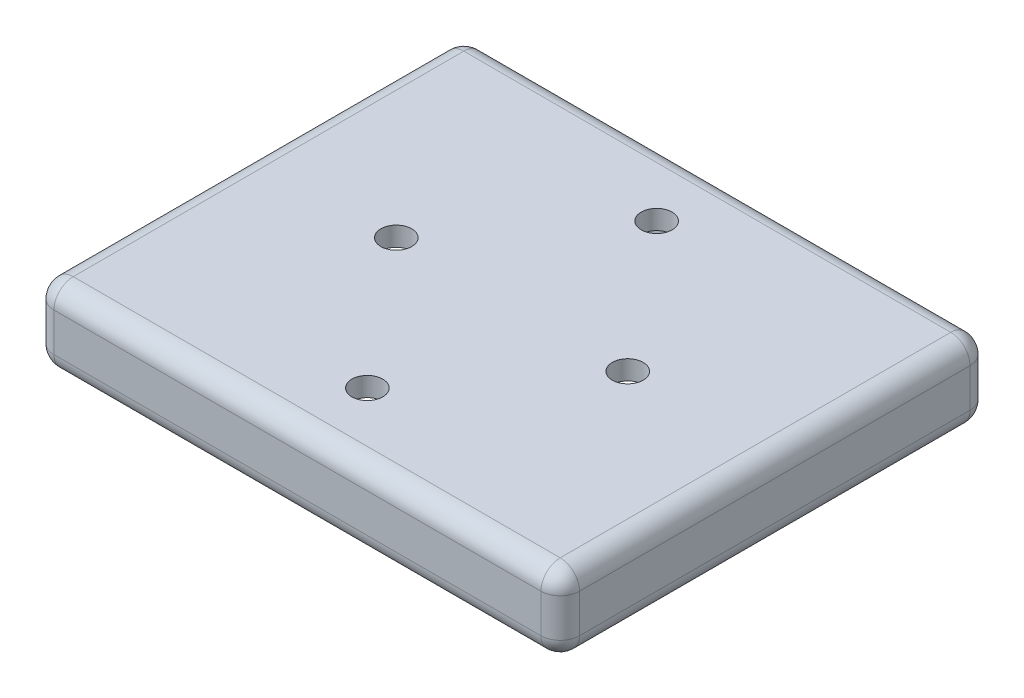
ISO-10303-21;
HEADER;
FILE_DESCRIPTION(('STEP AP214'),'2;1');
FILE_NAME('part.step','',(''),(''),'','','');
FILE_SCHEMA(('AUTOMOTIVE_DESIGN { 1 0 10303 214 1 1 1 1 }'));
ENDSEC;
DATA;
#1=APPLICATION_CONTEXT('core data for automotive mechanical design processes');
#2=APPLICATION_PROTOCOL_DEFINITION('international standard','automotive_design',2000,#1);
#3=PRODUCT_CONTEXT('',#1,'mechanical');
#4=PRODUCT('Part','Part','',(#3));
#5=PRODUCT_RELATED_PRODUCT_CATEGORY('part','',(#4));
#6=PRODUCT_DEFINITION_FORMATION('','',#4);
#7=PRODUCT_DEFINITION_CONTEXT('part definition',#1,'design');
#8=PRODUCT_DEFINITION('design','',#6,#7);
#9=PRODUCT_DEFINITION_SHAPE('','',#8);
#10=(LENGTH_UNIT() NAMED_UNIT(*) SI_UNIT(.MILLI.,.METRE.));
#11=(NAMED_UNIT(*) PLANE_ANGLE_UNIT() SI_UNIT($,.RADIAN.));
#12=(NAMED_UNIT(*) SI_UNIT($,.STERADIAN.) SOLID_ANGLE_UNIT());
#13=UNCERTAINTY_MEASURE_WITH_UNIT(LENGTH_MEASURE(1.E-05),#10,'distance_accuracy_value','');
#14=(GEOMETRIC_REPRESENTATION_CONTEXT(3) GLOBAL_UNCERTAINTY_ASSIGNED_CONTEXT((#13)) GLOBAL_UNIT_ASSIGNED_CONTEXT((#10,
#11,#12)) REPRESENTATION_CONTEXT('',''));
#15=CARTESIAN_POINT('',(0.,0.,0.));
#16=DIRECTION('',(0.,0.,1.));
#17=DIRECTION('',(1.,0.,0.));
#18=AXIS2_PLACEMENT_3D('',#15,#16,#17);
#19=CARTESIAN_POINT('',(0.,10.16,0.));
#20=DIRECTION('',(1.,0.,0.));
#21=DIRECTION('',(0.,0.,-1.));
#22=AXIS2_PLACEMENT_3D('',#19,#20,#21);
#23=PLANE('',#22);
#24=DIRECTION('',(0.,0.,1.));
#25=VECTOR('',#24,1.);
#26=CARTESIAN_POINT('',(0.,7.62,0.));
#27=LINE('',#26,#25);
#28=CARTESIAN_POINT('',(0.,7.62,-2.54));
#29=VERTEX_POINT('',#28);
#30=CARTESIAN_POINT('',(0.,7.62,-53.975));
#31=VERTEX_POINT('',#30);
#32=EDGE_CURVE('E227',#29,#31,#27,.F.);
#33=ORIENTED_EDGE('',*,*,#32,.T.);
#34=DIRECTION('',(0.,-1.,0.));
#35=VECTOR('',#34,1.);
#36=CARTESIAN_POINT('',(0.,10.16,-53.975));
#37=LINE('',#36,#35);
#38=CARTESIAN_POINT('',(0.,2.54,-53.975));
#39=VERTEX_POINT('',#38);
#40=EDGE_CURVE('E229',#31,#39,#37,.T.);
#41=ORIENTED_EDGE('',*,*,#40,.T.);
#42=DIRECTION('',(0.,0.,1.));
#43=VECTOR('',#42,1.);
#44=CARTESIAN_POINT('',(0.,2.54,0.));
#45=LINE('',#44,#43);
#46=CARTESIAN_POINT('',(0.,2.54,-2.54));
#47=VERTEX_POINT('',#46);
#48=EDGE_CURVE('E194',#39,#47,#45,.T.);
#49=ORIENTED_EDGE('',*,*,#48,.T.);
#50=DIRECTION('',(0.,-1.,0.));
#51=VECTOR('',#50,1.);
#52=CARTESIAN_POINT('',(0.,10.16,-2.54));
#53=LINE('',#52,#51);
#54=EDGE_CURVE('E225',#47,#29,#53,.F.);
#55=ORIENTED_EDGE('',*,*,#54,.T.);
#56=EDGE_LOOP('',(#33,#41,#49,#55));
#57=FACE_BOUND('',#56,.T.);
#58=ADVANCED_FACE('F39',(#57),#23,.F.);
#59=CARTESIAN_POINT('',(0.,10.16,0.));
#60=DIRECTION('',(0.,0.,-1.));
#61=DIRECTION('',(-1.,0.,0.));
#62=AXIS2_PLACEMENT_3D('',#59,#60,#61);
#63=PLANE('',#62);
#64=DIRECTION('',(1.,0.,0.));
#65=VECTOR('',#64,1.);
#66=CARTESIAN_POINT('',(0.,7.62,0.));
#67=LINE('',#66,#65);
#68=CARTESIAN_POINT('',(66.675,7.62,0.));
#69=VERTEX_POINT('',#68);
#70=CARTESIAN_POINT('',(2.54,7.62,0.));
#71=VERTEX_POINT('',#70);
#72=EDGE_CURVE('E233',#69,#71,#67,.F.);
#73=ORIENTED_EDGE('',*,*,#72,.T.);
#74=DIRECTION('',(0.,-1.,0.));
#75=VECTOR('',#74,1.);
#76=CARTESIAN_POINT('',(2.54,10.16,0.));
#77=LINE('',#76,#75);
#78=CARTESIAN_POINT('',(2.54,2.54,0.));
#79=VERTEX_POINT('',#78);
#80=EDGE_CURVE('E235',#71,#79,#77,.T.);
#81=ORIENTED_EDGE('',*,*,#80,.T.);
#82=DIRECTION('',(1.,0.,0.));
#83=VECTOR('',#82,1.);
#84=CARTESIAN_POINT('',(69.215,2.54,0.));
#85=LINE('',#84,#83);
#86=CARTESIAN_POINT('',(66.675,2.54,0.));
#87=VERTEX_POINT('',#86);
#88=EDGE_CURVE('E170',#79,#87,#85,.T.);
#89=ORIENTED_EDGE('',*,*,#88,.T.);
#90=DIRECTION('',(0.,-1.,0.));
#91=VECTOR('',#90,1.);
#92=CARTESIAN_POINT('',(66.675,10.16,0.));
#93=LINE('',#92,#91);
#94=EDGE_CURVE('E231',#87,#69,#93,.F.);
#95=ORIENTED_EDGE('',*,*,#94,.T.);
#96=EDGE_LOOP('',(#73,#81,#89,#95));
#97=FACE_BOUND('',#96,.T.);
#98=ADVANCED_FACE('F308',(#97),#63,.F.);
#99=CARTESIAN_POINT('',(69.215,10.16,0.));
#100=DIRECTION('',(-1.,0.,0.));
#101=DIRECTION('',(0.,0.,1.));
#102=AXIS2_PLACEMENT_3D('',#99,#100,#101);
#103=PLANE('',#102);
#104=DIRECTION('',(0.,0.,-1.));
#105=VECTOR('',#104,1.);
#106=CARTESIAN_POINT('',(69.215,2.54,-56.515));
#107=LINE('',#106,#105);
#108=CARTESIAN_POINT('',(69.215,2.54,-2.54));
#109=VERTEX_POINT('',#108);
#110=CARTESIAN_POINT('',(69.215,2.54,-53.975));
#111=VERTEX_POINT('',#110);
#112=EDGE_CURVE('E166',#109,#111,#107,.T.);
#113=ORIENTED_EDGE('',*,*,#112,.T.);
#114=DIRECTION('',(0.,-1.,0.));
#115=VECTOR('',#114,1.);
#116=CARTESIAN_POINT('',(69.215,10.16,-53.975));
#117=LINE('',#116,#115);
#118=CARTESIAN_POINT('',(69.215,7.62,-53.975));
#119=VERTEX_POINT('',#118);
#120=EDGE_CURVE('E241',#111,#119,#117,.F.);
#121=ORIENTED_EDGE('',*,*,#120,.T.);
#122=DIRECTION('',(0.,0.,-1.));
#123=VECTOR('',#122,1.);
#124=CARTESIAN_POINT('',(69.215,7.62,0.));
#125=LINE('',#124,#123);
#126=CARTESIAN_POINT('',(69.215,7.62,-2.54));
#127=VERTEX_POINT('',#126);
#128=EDGE_CURVE('E239',#119,#127,#125,.F.);
#129=ORIENTED_EDGE('',*,*,#128,.T.);
#130=DIRECTION('',(0.,-1.,0.));
#131=VECTOR('',#130,1.);
#132=CARTESIAN_POINT('',(69.215,10.16,-2.54));
#133=LINE('',#132,#131);
#134=EDGE_CURVE('E237',#127,#109,#133,.T.);
#135=ORIENTED_EDGE('',*,*,#134,.T.);
#136=EDGE_LOOP('',(#113,#121,#129,#135));
#137=FACE_BOUND('',#136,.T.);
#138=ADVANCED_FACE('F363',(#137),#103,.F.);
#139=CARTESIAN_POINT('',(0.,10.16,-56.515));
#140=DIRECTION('',(0.,0.,1.));
#141=DIRECTION('',(1.,0.,0.));
#142=AXIS2_PLACEMENT_3D('',#139,#140,#141);
#143=PLANE('',#142);
#144=DIRECTION('',(-1.,0.,0.));
#145=VECTOR('',#144,1.);
#146=CARTESIAN_POINT('',(0.,7.62,-56.515));
#147=LINE('',#146,#145);
#148=CARTESIAN_POINT('',(2.54,7.62,-56.515));
#149=VERTEX_POINT('',#148);
#150=CARTESIAN_POINT('',(66.675,7.62,-56.515));
#151=VERTEX_POINT('',#150);
#152=EDGE_CURVE('E48',#149,#151,#147,.F.);
#153=ORIENTED_EDGE('',*,*,#152,.T.);
#154=DIRECTION('',(0.,-1.,0.));
#155=VECTOR('',#154,1.);
#156=CARTESIAN_POINT('',(66.675,10.16,-56.515));
#157=LINE('',#156,#155);
#158=CARTESIAN_POINT('',(66.675,2.54,-56.515));
#159=VERTEX_POINT('',#158);
#160=EDGE_CURVE('E11',#151,#159,#157,.T.);
#161=ORIENTED_EDGE('',*,*,#160,.T.);
#162=DIRECTION('',(-1.,0.,0.));
#163=VECTOR('',#162,1.);
#164=CARTESIAN_POINT('',(0.,2.54,-56.515));
#165=LINE('',#164,#163);
#166=CARTESIAN_POINT('',(2.54,2.54,-56.515));
#167=VERTEX_POINT('',#166);
#168=EDGE_CURVE('E197',#159,#167,#165,.T.);
#169=ORIENTED_EDGE('',*,*,#168,.T.);
#170=DIRECTION('',(0.,-1.,0.));
#171=VECTOR('',#170,1.);
#172=CARTESIAN_POINT('',(2.54,10.16,-56.515));
#173=LINE('',#172,#171);
#174=EDGE_CURVE('E59',#167,#149,#173,.F.);
#175=ORIENTED_EDGE('',*,*,#174,.T.);
#176=EDGE_LOOP('',(#153,#161,#169,#175));
#177=FACE_BOUND('',#176,.T.);
#178=ADVANCED_FACE('F350',(#177),#143,.F.);
#179=CARTESIAN_POINT('',(0.,10.16,0.));
#180=DIRECTION('',(0.,-1.,0.));
#181=DIRECTION('',(0.,0.,-1.));
#182=AXIS2_PLACEMENT_3D('',#179,#180,#181);
#183=PLANE('',#182);
#184=CARTESIAN_POINT('',(34.6075,10.16,-9.2075));
#185=DIRECTION('',(0.,1.,0.));
#186=DIRECTION('',(0.,0.,1.));
#187=AXIS2_PLACEMENT_3D('',#184,#185,#186);
#188=CIRCLE('',#187,2.032);
#189=CARTESIAN_POINT('',(34.6075,10.16,-7.1755));
#190=VERTEX_POINT('',#189);
#191=EDGE_CURVE('E671',#190,#190,#188,.T.);
#192=ORIENTED_EDGE('',*,*,#191,.F.);
#193=EDGE_LOOP('',(#192));
#194=FACE_BOUND('',#193,.T.);
#195=CARTESIAN_POINT('',(34.6075,10.16,-47.3075));
#196=DIRECTION('',(0.,1.,0.));
#197=DIRECTION('',(0.,0.,1.));
#198=AXIS2_PLACEMENT_3D('',#195,#196,#197);
#199=CIRCLE('',#198,2.032);
#200=CARTESIAN_POINT('',(34.6075,10.16,-45.2755));
#201=VERTEX_POINT('',#200);
#202=EDGE_CURVE('E676',#201,#201,#199,.T.);
#203=ORIENTED_EDGE('',*,*,#202,.F.);
#204=EDGE_LOOP('',(#203));
#205=FACE_BOUND('',#204,.T.);
#206=CARTESIAN_POINT('',(19.3675,10.16,-28.2575));
#207=DIRECTION('',(0.,1.,0.));
#208=DIRECTION('',(0.,0.,1.));
#209=AXIS2_PLACEMENT_3D('',#206,#207,#208);
#210=CIRCLE('',#209,2.032);
#211=CARTESIAN_POINT('',(19.3675,10.16,-26.2255));
#212=VERTEX_POINT('',#211);
#213=EDGE_CURVE('E683',#212,#212,#210,.T.);
#214=ORIENTED_EDGE('',*,*,#213,.F.);
#215=EDGE_LOOP('',(#214));
#216=FACE_BOUND('',#215,.T.);
#217=CARTESIAN_POINT('',(49.8475,10.16,-28.2575));
#218=DIRECTION('',(0.,1.,0.));
#219=DIRECTION('',(0.,0.,1.));
#220=AXIS2_PLACEMENT_3D('',#217,#218,#219);
#221=CIRCLE('',#220,2.032);
#222=CARTESIAN_POINT('',(49.8475,10.16,-26.2255));
#223=VERTEX_POINT('',#222);
#224=EDGE_CURVE('E175',#223,#223,#221,.T.);
#225=ORIENTED_EDGE('',*,*,#224,.F.);
#226=EDGE_LOOP('',(#225));
#227=FACE_BOUND('',#226,.T.);
#228=DIRECTION('',(-1.,0.,0.));
#229=VECTOR('',#228,1.);
#230=CARTESIAN_POINT('',(0.,10.16,-53.975));
#231=LINE('',#230,#229);
#232=CARTESIAN_POINT('',(66.675,10.16,-53.975));
#233=VERTEX_POINT('',#232);
#234=CARTESIAN_POINT('',(2.54,10.16,-53.975));
#235=VERTEX_POINT('',#234);
#236=EDGE_CURVE('E216',#233,#235,#231,.T.);
#237=ORIENTED_EDGE('',*,*,#236,.T.);
#238=DIRECTION('',(0.,0.,1.));
#239=VECTOR('',#238,1.);
#240=CARTESIAN_POINT('',(2.54,10.16,0.));
#241=LINE('',#240,#239);
#242=CARTESIAN_POINT('',(2.54,10.16,-2.54));
#243=VERTEX_POINT('',#242);
#244=EDGE_CURVE('E222',#235,#243,#241,.T.);
#245=ORIENTED_EDGE('',*,*,#244,.T.);
#246=DIRECTION('',(1.,0.,0.));
#247=VECTOR('',#246,1.);
#248=CARTESIAN_POINT('',(0.,10.16,-2.54));
#249=LINE('',#248,#247);
#250=CARTESIAN_POINT('',(66.675,10.16,-2.54));
#251=VERTEX_POINT('',#250);
#252=EDGE_CURVE('E220',#243,#251,#249,.T.);
#253=ORIENTED_EDGE('',*,*,#252,.T.);
#254=DIRECTION('',(0.,0.,-1.));
#255=VECTOR('',#254,1.);
#256=CARTESIAN_POINT('',(66.675,10.16,0.));
#257=LINE('',#256,#255);
#258=EDGE_CURVE('E218',#251,#233,#257,.T.);
#259=ORIENTED_EDGE('',*,*,#258,.T.);
#260=EDGE_LOOP('',(#237,#245,#253,#259));
#261=FACE_BOUND('',#260,.T.);
#262=ADVANCED_FACE('F332',(#194,#205,#216,#227,#261),#183,.F.);
#263=CARTESIAN_POINT('',(2.54,10.16,0.));
#264=DIRECTION('',(1.,0.,0.));
#265=DIRECTION('',(0.,0.,-1.));
#266=AXIS2_PLACEMENT_3D('',#263,#264,#265);
#267=PLANE('',#266);
#268=DIRECTION('',(0.,0.,1.));
#269=VECTOR('',#268,1.);
#270=CARTESIAN_POINT('',(2.54,0.,0.));
#271=LINE('',#270,#269);
#272=CARTESIAN_POINT('',(2.54,0.,-53.975));
#273=VERTEX_POINT('',#272);
#274=CARTESIAN_POINT('',(2.54,0.,-2.54));
#275=VERTEX_POINT('',#274);
#276=EDGE_CURVE('E184',#273,#275,#271,.T.);
#277=ORIENTED_EDGE('',*,*,#276,.F.);
#278=DIRECTION('',(0.,-1.,0.));
#279=VECTOR('',#278,1.);
#280=CARTESIAN_POINT('',(2.54,10.16,-53.975));
#281=LINE('',#280,#279);
#282=CARTESIAN_POINT('',(2.54,7.62,-53.975));
#283=VERTEX_POINT('',#282);
#284=EDGE_CURVE('E159',#283,#273,#281,.T.);
#285=ORIENTED_EDGE('',*,*,#284,.F.);
#286=DIRECTION('',(0.,0.,1.));
#287=VECTOR('',#286,1.);
#288=CARTESIAN_POINT('',(2.54,7.62,0.));
#289=LINE('',#288,#287);
#290=CARTESIAN_POINT('',(2.54,7.62,-2.54));
#291=VERTEX_POINT('',#290);
#292=EDGE_CURVE('E144',#283,#291,#289,.T.);
#293=ORIENTED_EDGE('',*,*,#292,.T.);
#294=DIRECTION('',(0.,-1.,0.));
#295=VECTOR('',#294,1.);
#296=CARTESIAN_POINT('',(2.54,10.16,-2.54));
#297=LINE('',#296,#295);
#298=EDGE_CURVE('E156',#291,#275,#297,.T.);
#299=ORIENTED_EDGE('',*,*,#298,.T.);
#300=EDGE_LOOP('',(#277,#285,#293,#299));
#301=FACE_BOUND('',#300,.T.);
#302=ADVANCED_FACE('F155',(#301),#267,.T.);
#303=CARTESIAN_POINT('',(0.,10.16,-2.54));
#304=DIRECTION('',(0.,0.,-1.));
#305=DIRECTION('',(-1.,0.,0.));
#306=AXIS2_PLACEMENT_3D('',#303,#304,#305);
#307=PLANE('',#306);
#308=DIRECTION('',(1.,0.,0.));
#309=VECTOR('',#308,1.);
#310=CARTESIAN_POINT('',(0.,0.,-2.54));
#311=LINE('',#310,#309);
#312=CARTESIAN_POINT('',(66.675,0.,-2.54));
#313=VERTEX_POINT('',#312);
#314=EDGE_CURVE('E165',#275,#313,#311,.T.);
#315=ORIENTED_EDGE('',*,*,#314,.F.);
#316=ORIENTED_EDGE('',*,*,#298,.F.);
#317=DIRECTION('',(1.,0.,0.));
#318=VECTOR('',#317,1.);
#319=CARTESIAN_POINT('',(0.,7.62,-2.54));
#320=LINE('',#319,#318);
#321=CARTESIAN_POINT('',(66.675,7.62,-2.54));
#322=VERTEX_POINT('',#321);
#323=EDGE_CURVE('E140',#291,#322,#320,.T.);
#324=ORIENTED_EDGE('',*,*,#323,.T.);
#325=DIRECTION('',(0.,-1.,0.));
#326=VECTOR('',#325,1.);
#327=CARTESIAN_POINT('',(66.675,10.16,-2.54));
#328=LINE('',#327,#326);
#329=EDGE_CURVE('E167',#322,#313,#328,.T.);
#330=ORIENTED_EDGE('',*,*,#329,.T.);
#331=EDGE_LOOP('',(#315,#316,#324,#330));
#332=FACE_BOUND('',#331,.T.);
#333=ADVANCED_FACE('F163',(#332),#307,.T.);
#334=CARTESIAN_POINT('',(66.675,10.16,0.));
#335=DIRECTION('',(-1.,0.,0.));
#336=DIRECTION('',(0.,0.,1.));
#337=AXIS2_PLACEMENT_3D('',#334,#335,#336);
#338=PLANE('',#337);
#339=DIRECTION('',(0.,0.,-1.));
#340=VECTOR('',#339,1.);
#341=CARTESIAN_POINT('',(66.675,0.,0.));
#342=LINE('',#341,#340);
#343=CARTESIAN_POINT('',(66.675,0.,-53.975));
#344=VERTEX_POINT('',#343);
#345=EDGE_CURVE('E188',#313,#344,#342,.T.);
#346=ORIENTED_EDGE('',*,*,#345,.F.);
#347=ORIENTED_EDGE('',*,*,#329,.F.);
#348=DIRECTION('',(0.,0.,-1.));
#349=VECTOR('',#348,1.);
#350=CARTESIAN_POINT('',(66.675,7.62,0.));
#351=LINE('',#350,#349);
#352=CARTESIAN_POINT('',(66.675,7.62,-53.975));
#353=VERTEX_POINT('',#352);
#354=EDGE_CURVE('E145',#322,#353,#351,.T.);
#355=ORIENTED_EDGE('',*,*,#354,.T.);
#356=DIRECTION('',(0.,-1.,0.));
#357=VECTOR('',#356,1.);
#358=CARTESIAN_POINT('',(66.675,10.16,-53.975));
#359=LINE('',#358,#357);
#360=EDGE_CURVE('E172',#353,#344,#359,.T.);
#361=ORIENTED_EDGE('',*,*,#360,.T.);
#362=EDGE_LOOP('',(#346,#347,#355,#361));
#363=FACE_BOUND('',#362,.T.);
#364=ADVANCED_FACE('F460',(#363),#338,.T.);
#365=CARTESIAN_POINT('',(0.,10.16,-53.975));
#366=DIRECTION('',(0.,0.,1.));
#367=DIRECTION('',(1.,0.,0.));
#368=AXIS2_PLACEMENT_3D('',#365,#366,#367);
#369=PLANE('',#368);
#370=DIRECTION('',(-1.,0.,0.));
#371=VECTOR('',#370,1.);
#372=CARTESIAN_POINT('',(0.,0.,-53.975));
#373=LINE('',#372,#371);
#374=EDGE_CURVE('E160',#344,#273,#373,.T.);
#375=ORIENTED_EDGE('',*,*,#374,.F.);
#376=ORIENTED_EDGE('',*,*,#360,.F.);
#377=DIRECTION('',(-1.,0.,0.));
#378=VECTOR('',#377,1.);
#379=CARTESIAN_POINT('',(0.,7.62,-53.975));
#380=LINE('',#379,#378);
#381=EDGE_CURVE('E178',#353,#283,#380,.T.);
#382=ORIENTED_EDGE('',*,*,#381,.T.);
#383=ORIENTED_EDGE('',*,*,#284,.T.);
#384=EDGE_LOOP('',(#375,#376,#382,#383));
#385=FACE_BOUND('',#384,.T.);
#386=ADVANCED_FACE('F451',(#385),#369,.T.);
#387=CARTESIAN_POINT('',(0.,7.62,0.));
#388=DIRECTION('',(0.,-1.,0.));
#389=DIRECTION('',(0.,0.,-1.));
#390=AXIS2_PLACEMENT_3D('',#387,#388,#389);
#391=PLANE('',#390);
#392=CARTESIAN_POINT('',(34.6075,7.62,-9.2075));
#393=DIRECTION('',(0.,1.,0.));
#394=DIRECTION('',(0.,0.,1.));
#395=AXIS2_PLACEMENT_3D('',#392,#393,#394);
#396=CIRCLE('',#395,2.032);
#397=CARTESIAN_POINT('',(34.6075,7.62,-7.1755));
#398=VERTEX_POINT('',#397);
#399=EDGE_CURVE('E668',#398,#398,#396,.T.);
#400=ORIENTED_EDGE('',*,*,#399,.T.);
#401=EDGE_LOOP('',(#400));
#402=FACE_BOUND('',#401,.T.);
#403=CARTESIAN_POINT('',(34.6075,7.62,-47.3075));
#404=DIRECTION('',(0.,1.,0.));
#405=DIRECTION('',(0.,0.,1.));
#406=AXIS2_PLACEMENT_3D('',#403,#404,#405);
#407=CIRCLE('',#406,2.032);
#408=CARTESIAN_POINT('',(34.6075,7.62,-45.2755));
#409=VERTEX_POINT('',#408);
#410=EDGE_CURVE('E672',#409,#409,#407,.T.);
#411=ORIENTED_EDGE('',*,*,#410,.T.);
#412=EDGE_LOOP('',(#411));
#413=FACE_BOUND('',#412,.T.);
#414=CARTESIAN_POINT('',(19.3675,7.62,-28.2575));
#415=DIRECTION('',(0.,1.,0.));
#416=DIRECTION('',(0.,0.,1.));
#417=AXIS2_PLACEMENT_3D('',#414,#415,#416);
#418=CIRCLE('',#417,2.032);
#419=CARTESIAN_POINT('',(19.3675,7.62,-26.2255));
#420=VERTEX_POINT('',#419);
#421=EDGE_CURVE('E248',#420,#420,#418,.T.);
#422=ORIENTED_EDGE('',*,*,#421,.T.);
#423=EDGE_LOOP('',(#422));
#424=FACE_BOUND('',#423,.T.);
#425=CARTESIAN_POINT('',(49.8475,7.62,-28.2575));
#426=DIRECTION('',(0.,1.,0.));
#427=DIRECTION('',(0.,0.,1.));
#428=AXIS2_PLACEMENT_3D('',#425,#426,#427);
#429=CIRCLE('',#428,2.032);
#430=CARTESIAN_POINT('',(49.8475,7.62,-26.2255));
#431=VERTEX_POINT('',#430);
#432=EDGE_CURVE('E685',#431,#431,#429,.T.);
#433=ORIENTED_EDGE('',*,*,#432,.T.);
#434=EDGE_LOOP('',(#433));
#435=FACE_BOUND('',#434,.T.);
#436=ORIENTED_EDGE('',*,*,#292,.F.);
#437=ORIENTED_EDGE('',*,*,#381,.F.);
#438=ORIENTED_EDGE('',*,*,#354,.F.);
#439=ORIENTED_EDGE('',*,*,#323,.F.);
#440=EDGE_LOOP('',(#436,#437,#438,#439));
#441=FACE_BOUND('',#440,.T.);
#442=ADVANCED_FACE('F142',(#402,#413,#424,#435,#441),#391,.T.);
#443=CARTESIAN_POINT('',(2.54,2.54,0.));
#444=DIRECTION('',(0.,0.,-1.));
#445=DIRECTION('',(-1.,0.,0.));
#446=AXIS2_PLACEMENT_3D('',#443,#444,#445);
#447=CYLINDRICAL_SURFACE('',#446,2.54);
#448=ORIENTED_EDGE('',*,*,#48,.F.);
#449=CARTESIAN_POINT('',(2.54,2.54,-53.975));
#450=DIRECTION('',(0.,0.,-1.));
#451=DIRECTION('',(-1.,0.,0.));
#452=AXIS2_PLACEMENT_3D('',#449,#450,#451);
#453=CIRCLE('',#452,2.54);
#454=EDGE_CURVE('E210',#39,#273,#453,.F.);
#455=ORIENTED_EDGE('',*,*,#454,.T.);
#456=ORIENTED_EDGE('',*,*,#276,.T.);
#457=CARTESIAN_POINT('',(2.54,2.54,-2.54));
#458=DIRECTION('',(0.,0.,-1.));
#459=DIRECTION('',(-1.,0.,0.));
#460=AXIS2_PLACEMENT_3D('',#457,#458,#459);
#461=CIRCLE('',#460,2.54);
#462=EDGE_CURVE('E208',#275,#47,#461,.T.);
#463=ORIENTED_EDGE('',*,*,#462,.T.);
#464=EDGE_LOOP('',(#448,#455,#456,#463));
#465=FACE_BOUND('',#464,.T.);
#466=ADVANCED_FACE('F384',(#465),#447,.T.);
#467=CARTESIAN_POINT('',(0.,2.54,-2.54));
#468=DIRECTION('',(-1.,0.,0.));
#469=DIRECTION('',(0.,0.,1.));
#470=AXIS2_PLACEMENT_3D('',#467,#468,#469);
#471=CYLINDRICAL_SURFACE('',#470,2.54);
#472=ORIENTED_EDGE('',*,*,#88,.F.);
#473=CARTESIAN_POINT('',(2.54,2.54,-2.54));
#474=DIRECTION('',(-1.,0.,0.));
#475=DIRECTION('',(0.,0.,1.));
#476=AXIS2_PLACEMENT_3D('',#473,#474,#475);
#477=CIRCLE('',#476,2.54);
#478=EDGE_CURVE('E214',#79,#275,#477,.F.);
#479=ORIENTED_EDGE('',*,*,#478,.T.);
#480=ORIENTED_EDGE('',*,*,#314,.T.);
#481=CARTESIAN_POINT('',(66.675,2.54,-2.54));
#482=DIRECTION('',(-1.,0.,0.));
#483=DIRECTION('',(0.,0.,1.));
#484=AXIS2_PLACEMENT_3D('',#481,#482,#483);
#485=CIRCLE('',#484,2.54);
#486=EDGE_CURVE('E212',#313,#87,#485,.T.);
#487=ORIENTED_EDGE('',*,*,#486,.T.);
#488=EDGE_LOOP('',(#472,#479,#480,#487));
#489=FACE_BOUND('',#488,.T.);
#490=ADVANCED_FACE('F303',(#489),#471,.T.);
#491=CARTESIAN_POINT('',(0.,2.54,-53.975));
#492=DIRECTION('',(1.,0.,0.));
#493=DIRECTION('',(0.,0.,-1.));
#494=AXIS2_PLACEMENT_3D('',#491,#492,#493);
#495=CYLINDRICAL_SURFACE('',#494,2.54);
#496=ORIENTED_EDGE('',*,*,#168,.F.);
#497=CARTESIAN_POINT('',(66.675,2.54,-53.975));
#498=DIRECTION('',(1.,0.,0.));
#499=DIRECTION('',(0.,0.,-1.));
#500=AXIS2_PLACEMENT_3D('',#497,#498,#499);
#501=CIRCLE('',#500,2.54);
#502=EDGE_CURVE('E206',#159,#344,#501,.F.);
#503=ORIENTED_EDGE('',*,*,#502,.T.);
#504=ORIENTED_EDGE('',*,*,#374,.T.);
#505=CARTESIAN_POINT('',(2.54,2.54,-53.975));
#506=DIRECTION('',(1.,0.,0.));
#507=DIRECTION('',(0.,0.,-1.));
#508=AXIS2_PLACEMENT_3D('',#505,#506,#507);
#509=CIRCLE('',#508,2.54);
#510=EDGE_CURVE('E204',#273,#167,#509,.T.);
#511=ORIENTED_EDGE('',*,*,#510,.T.);
#512=EDGE_LOOP('',(#496,#503,#504,#511));
#513=FACE_BOUND('',#512,.T.);
#514=ADVANCED_FACE('F354',(#513),#495,.T.);
#515=CARTESIAN_POINT('',(66.675,2.54,0.));
#516=DIRECTION('',(0.,0.,1.));
#517=DIRECTION('',(1.,0.,0.));
#518=AXIS2_PLACEMENT_3D('',#515,#516,#517);
#519=CYLINDRICAL_SURFACE('',#518,2.54);
#520=ORIENTED_EDGE('',*,*,#345,.T.);
#521=CARTESIAN_POINT('',(66.675,2.54,-53.975));
#522=DIRECTION('',(0.,0.,1.));
#523=DIRECTION('',(1.,0.,0.));
#524=AXIS2_PLACEMENT_3D('',#521,#522,#523);
#525=CIRCLE('',#524,2.54);
#526=EDGE_CURVE('E201',#344,#111,#525,.T.);
#527=ORIENTED_EDGE('',*,*,#526,.T.);
#528=ORIENTED_EDGE('',*,*,#112,.F.);
#529=CARTESIAN_POINT('',(66.675,2.54,-2.54));
#530=DIRECTION('',(0.,0.,1.));
#531=DIRECTION('',(1.,0.,0.));
#532=AXIS2_PLACEMENT_3D('',#529,#530,#531);
#533=CIRCLE('',#532,2.54);
#534=EDGE_CURVE('E199',#109,#313,#533,.F.);
#535=ORIENTED_EDGE('',*,*,#534,.T.);
#536=EDGE_LOOP('',(#520,#527,#528,#535));
#537=FACE_BOUND('',#536,.T.);
#538=ADVANCED_FACE('F361',(#537),#519,.T.);
#539=CARTESIAN_POINT('',(2.54,2.54,-2.54));
#540=DIRECTION('',(0.,0.,1.));
#541=DIRECTION('',(1.,0.,0.));
#542=AXIS2_PLACEMENT_3D('',#539,#540,#541);
#543=SPHERICAL_SURFACE('',#542,2.54);
#544=ORIENTED_EDGE('',*,*,#462,.F.);
#545=ORIENTED_EDGE('',*,*,#478,.F.);
#546=CARTESIAN_POINT('',(2.54,2.54,-2.54));
#547=DIRECTION('',(0.,1.,0.));
#548=DIRECTION('',(0.,0.,1.));
#549=AXIS2_PLACEMENT_3D('',#546,#547,#548);
#550=CIRCLE('',#549,2.54);
#551=EDGE_CURVE('E43',#47,#79,#550,.T.);
#552=ORIENTED_EDGE('',*,*,#551,.F.);
#553=EDGE_LOOP('',(#544,#545,#552));
#554=FACE_BOUND('',#553,.T.);
#555=ADVANCED_FACE('F41',(#554),#543,.T.);
#556=CARTESIAN_POINT('',(2.54,10.16,-2.54));
#557=DIRECTION('',(0.,-1.,0.));
#558=DIRECTION('',(0.,0.,-1.));
#559=AXIS2_PLACEMENT_3D('',#556,#557,#558);
#560=CYLINDRICAL_SURFACE('',#559,2.54);
#561=ORIENTED_EDGE('',*,*,#551,.T.);
#562=ORIENTED_EDGE('',*,*,#80,.F.);
#563=CARTESIAN_POINT('',(2.54,7.62,-2.54));
#564=DIRECTION('',(0.,1.,0.));
#565=DIRECTION('',(0.,0.,1.));
#566=AXIS2_PLACEMENT_3D('',#563,#564,#565);
#567=CIRCLE('',#566,2.54);
#568=EDGE_CURVE('E286',#29,#71,#567,.T.);
#569=ORIENTED_EDGE('',*,*,#568,.F.);
#570=ORIENTED_EDGE('',*,*,#54,.F.);
#571=EDGE_LOOP('',(#561,#562,#569,#570));
#572=FACE_BOUND('',#571,.T.);
#573=ADVANCED_FACE('F297',(#572),#560,.T.);
#574=CARTESIAN_POINT('',(66.675,2.54,-2.54));
#575=DIRECTION('',(0.,0.,1.));
#576=DIRECTION('',(1.,0.,0.));
#577=AXIS2_PLACEMENT_3D('',#574,#575,#576);
#578=SPHERICAL_SURFACE('',#577,2.54);
#579=ORIENTED_EDGE('',*,*,#486,.F.);
#580=ORIENTED_EDGE('',*,*,#534,.F.);
#581=CARTESIAN_POINT('',(66.675,2.54,-2.54));
#582=DIRECTION('',(0.,1.,0.));
#583=DIRECTION('',(0.,0.,1.));
#584=AXIS2_PLACEMENT_3D('',#581,#582,#583);
#585=CIRCLE('',#584,2.54);
#586=EDGE_CURVE('E284',#87,#109,#585,.T.);
#587=ORIENTED_EDGE('',*,*,#586,.F.);
#588=EDGE_LOOP('',(#579,#580,#587));
#589=FACE_BOUND('',#588,.T.);
#590=ADVANCED_FACE('F313',(#589),#578,.T.);
#591=CARTESIAN_POINT('',(2.54,7.62,-2.54));
#592=DIRECTION('',(0.,0.,1.));
#593=DIRECTION('',(1.,0.,0.));
#594=AXIS2_PLACEMENT_3D('',#591,#592,#593);
#595=SPHERICAL_SURFACE('',#594,2.54);
#596=CARTESIAN_POINT('',(2.54,7.62,-2.54));
#597=DIRECTION('',(0.,0.,1.));
#598=DIRECTION('',(1.,0.,0.));
#599=AXIS2_PLACEMENT_3D('',#596,#597,#598);
#600=CIRCLE('',#599,2.54);
#601=EDGE_CURVE('E278',#29,#243,#600,.F.);
#602=ORIENTED_EDGE('',*,*,#601,.F.);
#603=ORIENTED_EDGE('',*,*,#568,.T.);
#604=CARTESIAN_POINT('',(2.54,7.62,-2.54));
#605=DIRECTION('',(-1.,0.,0.));
#606=DIRECTION('',(0.,0.,1.));
#607=AXIS2_PLACEMENT_3D('',#604,#605,#606);
#608=CIRCLE('',#607,2.54);
#609=EDGE_CURVE('E281',#243,#71,#608,.F.);
#610=ORIENTED_EDGE('',*,*,#609,.F.);
#611=EDGE_LOOP('',(#602,#603,#610));
#612=FACE_BOUND('',#611,.T.);
#613=ADVANCED_FACE('F325',(#612),#595,.T.);
#614=CARTESIAN_POINT('',(2.54,2.54,-53.975));
#615=DIRECTION('',(0.,0.,1.));
#616=DIRECTION('',(1.,0.,0.));
#617=AXIS2_PLACEMENT_3D('',#614,#615,#616);
#618=SPHERICAL_SURFACE('',#617,2.54);
#619=ORIENTED_EDGE('',*,*,#510,.F.);
#620=ORIENTED_EDGE('',*,*,#454,.F.);
#621=CARTESIAN_POINT('',(2.54,2.54,-53.975));
#622=DIRECTION('',(0.,1.,0.));
#623=DIRECTION('',(0.,0.,1.));
#624=AXIS2_PLACEMENT_3D('',#621,#622,#623);
#625=CIRCLE('',#624,2.54);
#626=EDGE_CURVE('E275',#167,#39,#625,.T.);
#627=ORIENTED_EDGE('',*,*,#626,.F.);
#628=EDGE_LOOP('',(#619,#620,#627));
#629=FACE_BOUND('',#628,.T.);
#630=ADVANCED_FACE('F415',(#629),#618,.T.);
#631=CARTESIAN_POINT('',(66.675,10.16,-2.54));
#632=DIRECTION('',(0.,-1.,0.));
#633=DIRECTION('',(0.,0.,-1.));
#634=AXIS2_PLACEMENT_3D('',#631,#632,#633);
#635=CYLINDRICAL_SURFACE('',#634,2.54);
#636=ORIENTED_EDGE('',*,*,#586,.T.);
#637=ORIENTED_EDGE('',*,*,#134,.F.);
#638=CARTESIAN_POINT('',(66.675,7.62,-2.54));
#639=DIRECTION('',(0.,1.,0.));
#640=DIRECTION('',(0.,0.,1.));
#641=AXIS2_PLACEMENT_3D('',#638,#639,#640);
#642=CIRCLE('',#641,2.54);
#643=EDGE_CURVE('E272',#69,#127,#642,.T.);
#644=ORIENTED_EDGE('',*,*,#643,.F.);
#645=ORIENTED_EDGE('',*,*,#94,.F.);
#646=EDGE_LOOP('',(#636,#637,#644,#645));
#647=FACE_BOUND('',#646,.T.);
#648=ADVANCED_FACE('F317',(#647),#635,.T.);
#649=CARTESIAN_POINT('',(0.,7.62,-2.54));
#650=DIRECTION('',(1.,0.,0.));
#651=DIRECTION('',(0.,0.,-1.));
#652=AXIS2_PLACEMENT_3D('',#649,#650,#651);
#653=CYLINDRICAL_SURFACE('',#652,2.54);
#654=ORIENTED_EDGE('',*,*,#609,.T.);
#655=ORIENTED_EDGE('',*,*,#72,.F.);
#656=CARTESIAN_POINT('',(66.675,7.62,-2.54));
#657=DIRECTION('',(1.,0.,0.));
#658=DIRECTION('',(0.,0.,-1.));
#659=AXIS2_PLACEMENT_3D('',#656,#657,#658);
#660=CIRCLE('',#659,2.54);
#661=EDGE_CURVE('E269',#251,#69,#660,.T.);
#662=ORIENTED_EDGE('',*,*,#661,.F.);
#663=ORIENTED_EDGE('',*,*,#252,.F.);
#664=EDGE_LOOP('',(#654,#655,#662,#663));
#665=FACE_BOUND('',#664,.T.);
#666=ADVANCED_FACE('F324',(#665),#653,.T.);
#667=CARTESIAN_POINT('',(2.54,7.62,0.));
#668=DIRECTION('',(0.,0.,1.));
#669=DIRECTION('',(1.,0.,0.));
#670=AXIS2_PLACEMENT_3D('',#667,#668,#669);
#671=CYLINDRICAL_SURFACE('',#670,2.54);
#672=ORIENTED_EDGE('',*,*,#601,.T.);
#673=ORIENTED_EDGE('',*,*,#244,.F.);
#674=CARTESIAN_POINT('',(2.54,7.62,-53.975));
#675=DIRECTION('',(0.,0.,-1.));
#676=DIRECTION('',(-1.,0.,0.));
#677=AXIS2_PLACEMENT_3D('',#674,#675,#676);
#678=CIRCLE('',#677,2.54);
#679=EDGE_CURVE('E266',#31,#235,#678,.T.);
#680=ORIENTED_EDGE('',*,*,#679,.F.);
#681=ORIENTED_EDGE('',*,*,#32,.F.);
#682=EDGE_LOOP('',(#672,#673,#680,#681));
#683=FACE_BOUND('',#682,.T.);
#684=ADVANCED_FACE('F329',(#683),#671,.T.);
#685=CARTESIAN_POINT('',(2.54,10.16,-53.975));
#686=DIRECTION('',(0.,-1.,0.));
#687=DIRECTION('',(0.,0.,-1.));
#688=AXIS2_PLACEMENT_3D('',#685,#686,#687);
#689=CYLINDRICAL_SURFACE('',#688,2.54);
#690=ORIENTED_EDGE('',*,*,#626,.T.);
#691=ORIENTED_EDGE('',*,*,#40,.F.);
#692=CARTESIAN_POINT('',(2.54,7.62,-53.975));
#693=DIRECTION('',(0.,1.,0.));
#694=DIRECTION('',(0.,0.,1.));
#695=AXIS2_PLACEMENT_3D('',#692,#693,#694);
#696=CIRCLE('',#695,2.54);
#697=EDGE_CURVE('E263',#149,#31,#696,.T.);
#698=ORIENTED_EDGE('',*,*,#697,.F.);
#699=ORIENTED_EDGE('',*,*,#174,.F.);
#700=EDGE_LOOP('',(#690,#691,#698,#699));
#701=FACE_BOUND('',#700,.T.);
#702=ADVANCED_FACE('F405',(#701),#689,.T.);
#703=CARTESIAN_POINT('',(66.675,7.62,-2.54));
#704=DIRECTION('',(0.,0.,1.));
#705=DIRECTION('',(1.,0.,0.));
#706=AXIS2_PLACEMENT_3D('',#703,#704,#705);
#707=SPHERICAL_SURFACE('',#706,2.54);
#708=ORIENTED_EDGE('',*,*,#661,.T.);
#709=ORIENTED_EDGE('',*,*,#643,.T.);
#710=CARTESIAN_POINT('',(66.675,7.62,-2.54));
#711=DIRECTION('',(0.,0.,1.));
#712=DIRECTION('',(1.,0.,0.));
#713=AXIS2_PLACEMENT_3D('',#710,#711,#712);
#714=CIRCLE('',#713,2.54);
#715=EDGE_CURVE('E260',#251,#127,#714,.F.);
#716=ORIENTED_EDGE('',*,*,#715,.F.);
#717=EDGE_LOOP('',(#708,#709,#716));
#718=FACE_BOUND('',#717,.T.);
#719=ADVANCED_FACE('F321',(#718),#707,.T.);
#720=CARTESIAN_POINT('',(2.54,7.62,-53.975));
#721=DIRECTION('',(0.,0.,1.));
#722=DIRECTION('',(1.,0.,0.));
#723=AXIS2_PLACEMENT_3D('',#720,#721,#722);
#724=SPHERICAL_SURFACE('',#723,2.54);
#725=ORIENTED_EDGE('',*,*,#697,.T.);
#726=ORIENTED_EDGE('',*,*,#679,.T.);
#727=CARTESIAN_POINT('',(2.54,7.62,-53.975));
#728=DIRECTION('',(-1.,0.,0.));
#729=DIRECTION('',(0.,0.,1.));
#730=AXIS2_PLACEMENT_3D('',#727,#728,#729);
#731=CIRCLE('',#730,2.54);
#732=EDGE_CURVE('E257',#149,#235,#731,.F.);
#733=ORIENTED_EDGE('',*,*,#732,.F.);
#734=EDGE_LOOP('',(#725,#726,#733));
#735=FACE_BOUND('',#734,.T.);
#736=ADVANCED_FACE('F399',(#735),#724,.T.);
#737=CARTESIAN_POINT('',(66.675,7.62,0.));
#738=DIRECTION('',(0.,0.,-1.));
#739=DIRECTION('',(-1.,0.,0.));
#740=AXIS2_PLACEMENT_3D('',#737,#738,#739);
#741=CYLINDRICAL_SURFACE('',#740,2.54);
#742=ORIENTED_EDGE('',*,*,#715,.T.);
#743=ORIENTED_EDGE('',*,*,#128,.F.);
#744=CARTESIAN_POINT('',(66.675,7.62,-53.975));
#745=DIRECTION('',(0.,0.,-1.));
#746=DIRECTION('',(-1.,0.,0.));
#747=AXIS2_PLACEMENT_3D('',#744,#745,#746);
#748=CIRCLE('',#747,2.54);
#749=EDGE_CURVE('E254',#233,#119,#748,.T.);
#750=ORIENTED_EDGE('',*,*,#749,.F.);
#751=ORIENTED_EDGE('',*,*,#258,.F.);
#752=EDGE_LOOP('',(#742,#743,#750,#751));
#753=FACE_BOUND('',#752,.T.);
#754=ADVANCED_FACE('F341',(#753),#741,.T.);
#755=CARTESIAN_POINT('',(0.,7.62,-53.975));
#756=DIRECTION('',(-1.,0.,0.));
#757=DIRECTION('',(0.,0.,1.));
#758=AXIS2_PLACEMENT_3D('',#755,#756,#757);
#759=CYLINDRICAL_SURFACE('',#758,2.54);
#760=ORIENTED_EDGE('',*,*,#732,.T.);
#761=ORIENTED_EDGE('',*,*,#236,.F.);
#762=CARTESIAN_POINT('',(66.675,7.62,-53.975));
#763=DIRECTION('',(1.,0.,0.));
#764=DIRECTION('',(0.,0.,-1.));
#765=AXIS2_PLACEMENT_3D('',#762,#763,#764);
#766=CIRCLE('',#765,2.54);
#767=EDGE_CURVE('E251',#151,#233,#766,.T.);
#768=ORIENTED_EDGE('',*,*,#767,.F.);
#769=ORIENTED_EDGE('',*,*,#152,.F.);
#770=EDGE_LOOP('',(#760,#761,#768,#769));
#771=FACE_BOUND('',#770,.T.);
#772=ADVANCED_FACE('F336',(#771),#759,.T.);
#773=CARTESIAN_POINT('',(66.675,7.62,-53.975));
#774=DIRECTION('',(0.,0.,1.));
#775=DIRECTION('',(1.,0.,0.));
#776=AXIS2_PLACEMENT_3D('',#773,#774,#775);
#777=SPHERICAL_SURFACE('',#776,2.54);
#778=ORIENTED_EDGE('',*,*,#767,.T.);
#779=ORIENTED_EDGE('',*,*,#749,.T.);
#780=CARTESIAN_POINT('',(66.675,7.62,-53.975));
#781=DIRECTION('',(0.,1.,0.));
#782=DIRECTION('',(0.,0.,1.));
#783=AXIS2_PLACEMENT_3D('',#780,#781,#782);
#784=CIRCLE('',#783,2.54);
#785=EDGE_CURVE('E247',#151,#119,#784,.F.);
#786=ORIENTED_EDGE('',*,*,#785,.F.);
#787=EDGE_LOOP('',(#778,#779,#786));
#788=FACE_BOUND('',#787,.T.);
#789=ADVANCED_FACE('F343',(#788),#777,.T.);
#790=CARTESIAN_POINT('',(66.675,10.16,-53.975));
#791=DIRECTION('',(0.,-1.,0.));
#792=DIRECTION('',(0.,0.,-1.));
#793=AXIS2_PLACEMENT_3D('',#790,#791,#792);
#794=CYLINDRICAL_SURFACE('',#793,2.54);
#795=ORIENTED_EDGE('',*,*,#785,.T.);
#796=ORIENTED_EDGE('',*,*,#120,.F.);
#797=CARTESIAN_POINT('',(66.675,2.54,-53.975));
#798=DIRECTION('',(0.,-1.,0.));
#799=DIRECTION('',(0.,0.,-1.));
#800=AXIS2_PLACEMENT_3D('',#797,#798,#799);
#801=CIRCLE('',#800,2.54);
#802=EDGE_CURVE('E245',#159,#111,#801,.T.);
#803=ORIENTED_EDGE('',*,*,#802,.F.);
#804=ORIENTED_EDGE('',*,*,#160,.F.);
#805=EDGE_LOOP('',(#795,#796,#803,#804));
#806=FACE_BOUND('',#805,.T.);
#807=ADVANCED_FACE('F348',(#806),#794,.T.);
#808=CARTESIAN_POINT('',(66.675,2.54,-53.975));
#809=DIRECTION('',(0.,0.,1.));
#810=DIRECTION('',(1.,0.,0.));
#811=AXIS2_PLACEMENT_3D('',#808,#809,#810);
#812=SPHERICAL_SURFACE('',#811,2.54);
#813=ORIENTED_EDGE('',*,*,#526,.F.);
#814=ORIENTED_EDGE('',*,*,#502,.F.);
#815=ORIENTED_EDGE('',*,*,#802,.T.);
#816=EDGE_LOOP('',(#813,#814,#815));
#817=FACE_BOUND('',#816,.T.);
#818=ADVANCED_FACE('F358',(#817),#812,.T.);
#819=CARTESIAN_POINT('',(49.8475,7.62,-28.2575));
#820=DIRECTION('',(0.,1.,0.));
#821=DIRECTION('',(0.,0.,1.));
#822=AXIS2_PLACEMENT_3D('',#819,#820,#821);
#823=CYLINDRICAL_SURFACE('',#822,2.032);
#824=ORIENTED_EDGE('',*,*,#432,.F.);
#825=EDGE_LOOP('',(#824));
#826=FACE_BOUND('',#825,.T.);
#827=ORIENTED_EDGE('',*,*,#224,.T.);
#828=EDGE_LOOP('',(#827));
#829=FACE_BOUND('',#828,.T.);
#830=ADVANCED_FACE('F390',(#826,#829),#823,.F.);
#831=CARTESIAN_POINT('',(19.3675,7.62,-28.2575));
#832=DIRECTION('',(0.,1.,0.));
#833=DIRECTION('',(0.,0.,1.));
#834=AXIS2_PLACEMENT_3D('',#831,#832,#833);
#835=CYLINDRICAL_SURFACE('',#834,2.032);
#836=ORIENTED_EDGE('',*,*,#421,.F.);
#837=EDGE_LOOP('',(#836));
#838=FACE_BOUND('',#837,.T.);
#839=ORIENTED_EDGE('',*,*,#213,.T.);
#840=EDGE_LOOP('',(#839));
#841=FACE_BOUND('',#840,.T.);
#842=ADVANCED_FACE('F620',(#838,#841),#835,.F.);
#843=CARTESIAN_POINT('',(34.6075,7.62,-47.3075));
#844=DIRECTION('',(0.,1.,0.));
#845=DIRECTION('',(0.,0.,1.));
#846=AXIS2_PLACEMENT_3D('',#843,#844,#845);
#847=CYLINDRICAL_SURFACE('',#846,2.032);
#848=ORIENTED_EDGE('',*,*,#410,.F.);
#849=EDGE_LOOP('',(#848));
#850=FACE_BOUND('',#849,.T.);
#851=ORIENTED_EDGE('',*,*,#202,.T.);
#852=EDGE_LOOP('',(#851));
#853=FACE_BOUND('',#852,.T.);
#854=ADVANCED_FACE('F628',(#850,#853),#847,.F.);
#855=CARTESIAN_POINT('',(34.6075,7.62,-9.2075));
#856=DIRECTION('',(0.,1.,0.));
#857=DIRECTION('',(0.,0.,1.));
#858=AXIS2_PLACEMENT_3D('',#855,#856,#857);
#859=CYLINDRICAL_SURFACE('',#858,2.032);
#860=ORIENTED_EDGE('',*,*,#399,.F.);
#861=EDGE_LOOP('',(#860));
#862=FACE_BOUND('',#861,.T.);
#863=ORIENTED_EDGE('',*,*,#191,.T.);
#864=EDGE_LOOP('',(#863));
#865=FACE_BOUND('',#864,.T.);
#866=ADVANCED_FACE('F636',(#862,#865),#859,.F.);
#867=CLOSED_SHELL('',(#58,#98,#138,#178,#262,#302,#333,#364,#386,#442,#466,#490,#514,#538,#555,
#573,#590,#613,#630,#648,#666,#684,#702,#719,#736,#754,#772,#789,#807,#818,#830,#842,#854,#866));
#868=MANIFOLD_SOLID_BREP('B2',#867);
#869=ADVANCED_BREP_SHAPE_REPRESENTATION('',(#18,#868),#14);
#870=SHAPE_DEFINITION_REPRESENTATION(#9,#869);
ENDSEC;
END-ISO-10303-21;
